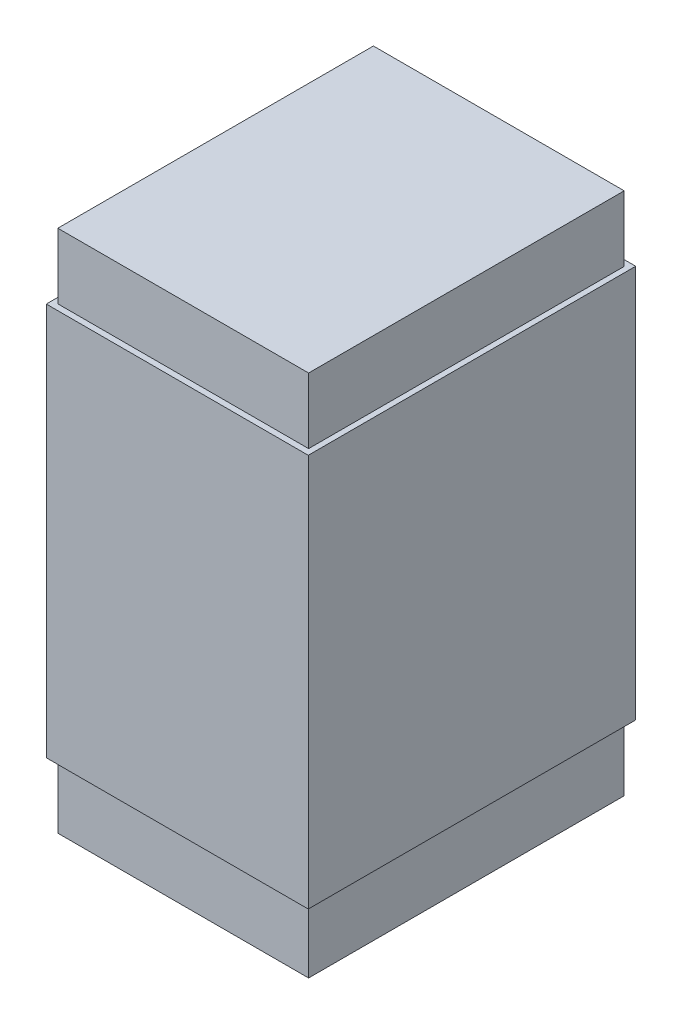
ISO-10303-21;
HEADER;
FILE_DESCRIPTION(('STEP AP214'),'2;1');
FILE_NAME('part.step','',(''),(''),'','','');
FILE_SCHEMA(('AUTOMOTIVE_DESIGN { 1 0 10303 214 1 1 1 1 }'));
ENDSEC;
DATA;
#1=APPLICATION_CONTEXT('core data for automotive mechanical design processes');
#2=APPLICATION_PROTOCOL_DEFINITION('international standard','automotive_design',2000,#1);
#3=PRODUCT_CONTEXT('',#1,'mechanical');
#4=PRODUCT('Part','Part','',(#3));
#5=PRODUCT_RELATED_PRODUCT_CATEGORY('part','',(#4));
#6=PRODUCT_DEFINITION_FORMATION('','',#4);
#7=PRODUCT_DEFINITION_CONTEXT('part definition',#1,'design');
#8=PRODUCT_DEFINITION('design','',#6,#7);
#9=PRODUCT_DEFINITION_SHAPE('','',#8);
#10=(LENGTH_UNIT() NAMED_UNIT(*) SI_UNIT(.MILLI.,.METRE.));
#11=(NAMED_UNIT(*) PLANE_ANGLE_UNIT() SI_UNIT($,.RADIAN.));
#12=(NAMED_UNIT(*) SI_UNIT($,.STERADIAN.) SOLID_ANGLE_UNIT());
#13=UNCERTAINTY_MEASURE_WITH_UNIT(LENGTH_MEASURE(1.E-05),#10,'distance_accuracy_value','');
#14=(GEOMETRIC_REPRESENTATION_CONTEXT(3) GLOBAL_UNCERTAINTY_ASSIGNED_CONTEXT((#13)) GLOBAL_UNIT_ASSIGNED_CONTEXT((#10,
#11,#12)) REPRESENTATION_CONTEXT('',''));
#15=CARTESIAN_POINT('',(0.,0.,0.));
#16=DIRECTION('',(0.,0.,1.));
#17=DIRECTION('',(1.,0.,0.));
#18=AXIS2_PLACEMENT_3D('',#15,#16,#17);
#19=CARTESIAN_POINT('',(0.,0.,0.));
#20=DIRECTION('',(0.,-1.,0.));
#21=DIRECTION('',(0.,0.,-1.));
#22=AXIS2_PLACEMENT_3D('',#19,#20,#21);
#23=PLANE('',#22);
#24=DIRECTION('',(0.,0.,-1.));
#25=VECTOR('',#24,1.);
#26=CARTESIAN_POINT('',(0.4,0.,0.5));
#27=LINE('',#26,#25);
#28=CARTESIAN_POINT('',(0.4,0.,0.5));
#29=VERTEX_POINT('',#28);
#30=CARTESIAN_POINT('',(0.4,0.,-0.5));
#31=VERTEX_POINT('',#30);
#32=EDGE_CURVE('E181',#29,#31,#27,.T.);
#33=ORIENTED_EDGE('',*,*,#32,.F.);
#34=DIRECTION('',(1.,0.,0.));
#35=VECTOR('',#34,1.);
#36=CARTESIAN_POINT('',(-0.4,0.,0.5));
#37=LINE('',#36,#35);
#38=CARTESIAN_POINT('',(-0.4,0.,0.5));
#39=VERTEX_POINT('',#38);
#40=EDGE_CURVE('E186',#39,#29,#37,.T.);
#41=ORIENTED_EDGE('',*,*,#40,.F.);
#42=DIRECTION('',(0.,0.,1.));
#43=VECTOR('',#42,1.);
#44=CARTESIAN_POINT('',(-0.4,0.,0.5));
#45=LINE('',#44,#43);
#46=CARTESIAN_POINT('',(-0.4,0.,-0.5));
#47=VERTEX_POINT('',#46);
#48=EDGE_CURVE('E197',#47,#39,#45,.T.);
#49=ORIENTED_EDGE('',*,*,#48,.F.);
#50=DIRECTION('',(-1.,0.,0.));
#51=VECTOR('',#50,1.);
#52=CARTESIAN_POINT('',(-0.4,0.,-0.5));
#53=LINE('',#52,#51);
#54=EDGE_CURVE('E195',#31,#47,#53,.T.);
#55=ORIENTED_EDGE('',*,*,#54,.F.);
#56=EDGE_LOOP('',(#33,#41,#49,#55));
#57=FACE_BOUND('',#56,.T.);
#58=DIRECTION('',(-1.,0.,0.));
#59=VECTOR('',#58,1.);
#60=CARTESIAN_POINT('',(0.382947673415401,0.,0.481860311538185));
#61=LINE('',#60,#59);
#62=CARTESIAN_POINT('',(0.382947673415401,0.,0.481860311538185));
#63=VERTEX_POINT('',#62);
#64=CARTESIAN_POINT('',(-0.382947673415401,0.,0.481860311538185));
#65=VERTEX_POINT('',#64);
#66=EDGE_CURVE('E371',#63,#65,#61,.T.);
#67=ORIENTED_EDGE('',*,*,#66,.F.);
#68=DIRECTION('',(0.,0.,1.));
#69=VECTOR('',#68,1.);
#70=CARTESIAN_POINT('',(0.382947673415401,0.,-0.481860311538185));
#71=LINE('',#70,#69);
#72=CARTESIAN_POINT('',(0.382947673415401,0.,-0.481860311538185));
#73=VERTEX_POINT('',#72);
#74=EDGE_CURVE('E145',#73,#63,#71,.T.);
#75=ORIENTED_EDGE('',*,*,#74,.F.);
#76=DIRECTION('',(1.,0.,0.));
#77=VECTOR('',#76,1.);
#78=CARTESIAN_POINT('',(-0.382947673415401,0.,-0.481860311538185));
#79=LINE('',#78,#77);
#80=CARTESIAN_POINT('',(-0.382947673415401,0.,-0.481860311538185));
#81=VERTEX_POINT('',#80);
#82=EDGE_CURVE('E141',#81,#73,#79,.T.);
#83=ORIENTED_EDGE('',*,*,#82,.F.);
#84=DIRECTION('',(0.,0.,-1.));
#85=VECTOR('',#84,1.);
#86=CARTESIAN_POINT('',(-0.382947673415401,0.,0.481860311538185));
#87=LINE('',#86,#85);
#88=EDGE_CURVE('E368',#65,#81,#87,.T.);
#89=ORIENTED_EDGE('',*,*,#88,.F.);
#90=EDGE_LOOP('',(#67,#75,#83,#89));
#91=FACE_BOUND('',#90,.T.);
#92=ADVANCED_FACE('F33',(#57,#91),#23,.T.);
#93=CARTESIAN_POINT('',(0.,1.2,0.));
#94=DIRECTION('',(0.,-1.,0.));
#95=DIRECTION('',(0.,0.,-1.));
#96=AXIS2_PLACEMENT_3D('',#93,#94,#95);
#97=PLANE('',#96);
#98=DIRECTION('',(0.,0.,-1.));
#99=VECTOR('',#98,1.);
#100=CARTESIAN_POINT('',(0.4,1.2,0.5));
#101=LINE('',#100,#99);
#102=CARTESIAN_POINT('',(0.4,1.2,0.5));
#103=VERTEX_POINT('',#102);
#104=CARTESIAN_POINT('',(0.4,1.2,-0.5));
#105=VERTEX_POINT('',#104);
#106=EDGE_CURVE('E182',#103,#105,#101,.T.);
#107=ORIENTED_EDGE('',*,*,#106,.T.);
#108=DIRECTION('',(-1.,0.,0.));
#109=VECTOR('',#108,1.);
#110=CARTESIAN_POINT('',(-0.4,1.2,-0.5));
#111=LINE('',#110,#109);
#112=CARTESIAN_POINT('',(-0.4,1.2,-0.5));
#113=VERTEX_POINT('',#112);
#114=EDGE_CURVE('E185',#105,#113,#111,.T.);
#115=ORIENTED_EDGE('',*,*,#114,.T.);
#116=DIRECTION('',(0.,0.,1.));
#117=VECTOR('',#116,1.);
#118=CARTESIAN_POINT('',(-0.4,1.2,0.5));
#119=LINE('',#118,#117);
#120=CARTESIAN_POINT('',(-0.4,1.2,0.5));
#121=VERTEX_POINT('',#120);
#122=EDGE_CURVE('E188',#113,#121,#119,.T.);
#123=ORIENTED_EDGE('',*,*,#122,.T.);
#124=DIRECTION('',(1.,0.,0.));
#125=VECTOR('',#124,1.);
#126=CARTESIAN_POINT('',(-0.4,1.2,0.5));
#127=LINE('',#126,#125);
#128=EDGE_CURVE('E190',#121,#103,#127,.T.);
#129=ORIENTED_EDGE('',*,*,#128,.T.);
#130=EDGE_LOOP('',(#107,#115,#123,#129));
#131=FACE_BOUND('',#130,.T.);
#132=DIRECTION('',(0.,0.,-1.));
#133=VECTOR('',#132,1.);
#134=CARTESIAN_POINT('',(0.382947673415401,1.2,0.481860311538185));
#135=LINE('',#134,#133);
#136=CARTESIAN_POINT('',(0.382947673415401,1.2,0.481860311538185));
#137=VERTEX_POINT('',#136);
#138=CARTESIAN_POINT('',(0.382947673415401,1.2,-0.481860311538185));
#139=VERTEX_POINT('',#138);
#140=EDGE_CURVE('E147',#137,#139,#135,.T.);
#141=ORIENTED_EDGE('',*,*,#140,.F.);
#142=DIRECTION('',(1.,0.,0.));
#143=VECTOR('',#142,1.);
#144=CARTESIAN_POINT('',(-0.382947673415401,1.2,0.481860311538185));
#145=LINE('',#144,#143);
#146=CARTESIAN_POINT('',(-0.382947673415401,1.2,0.481860311538185));
#147=VERTEX_POINT('',#146);
#148=EDGE_CURVE('E158',#147,#137,#145,.T.);
#149=ORIENTED_EDGE('',*,*,#148,.F.);
#150=DIRECTION('',(0.,0.,1.));
#151=VECTOR('',#150,1.);
#152=CARTESIAN_POINT('',(-0.382947673415401,1.2,0.481860311538185));
#153=LINE('',#152,#151);
#154=CARTESIAN_POINT('',(-0.382947673415401,1.2,-0.481860311538185));
#155=VERTEX_POINT('',#154);
#156=EDGE_CURVE('E166',#155,#147,#153,.T.);
#157=ORIENTED_EDGE('',*,*,#156,.F.);
#158=DIRECTION('',(-1.,0.,0.));
#159=VECTOR('',#158,1.);
#160=CARTESIAN_POINT('',(-0.382947673415401,1.2,-0.481860311538185));
#161=LINE('',#160,#159);
#162=EDGE_CURVE('E56',#139,#155,#161,.T.);
#163=ORIENTED_EDGE('',*,*,#162,.F.);
#164=EDGE_LOOP('',(#141,#149,#157,#163));
#165=FACE_BOUND('',#164,.T.);
#166=ADVANCED_FACE('F224',(#131,#165),#97,.F.);
#167=CARTESIAN_POINT('',(0.4,1.2,0.5));
#168=DIRECTION('',(-1.,0.,0.));
#169=DIRECTION('',(0.,0.,1.));
#170=AXIS2_PLACEMENT_3D('',#167,#168,#169);
#171=PLANE('',#170);
#172=ORIENTED_EDGE('',*,*,#32,.T.);
#173=DIRECTION('',(0.,-1.,0.));
#174=VECTOR('',#173,1.);
#175=CARTESIAN_POINT('',(0.4,1.2,-0.5));
#176=LINE('',#175,#174);
#177=EDGE_CURVE('E11',#105,#31,#176,.T.);
#178=ORIENTED_EDGE('',*,*,#177,.F.);
#179=ORIENTED_EDGE('',*,*,#106,.F.);
#180=DIRECTION('',(0.,-1.,0.));
#181=VECTOR('',#180,1.);
#182=CARTESIAN_POINT('',(0.4,1.2,0.5));
#183=LINE('',#182,#181);
#184=EDGE_CURVE('E192',#103,#29,#183,.T.);
#185=ORIENTED_EDGE('',*,*,#184,.T.);
#186=EDGE_LOOP('',(#172,#178,#179,#185));
#187=FACE_BOUND('',#186,.T.);
#188=ADVANCED_FACE('F35',(#187),#171,.F.);
#189=CARTESIAN_POINT('',(-0.4,1.2,-0.5));
#190=DIRECTION('',(0.,0.,1.));
#191=DIRECTION('',(1.,0.,0.));
#192=AXIS2_PLACEMENT_3D('',#189,#190,#191);
#193=PLANE('',#192);
#194=ORIENTED_EDGE('',*,*,#54,.T.);
#195=DIRECTION('',(0.,-1.,0.));
#196=VECTOR('',#195,1.);
#197=CARTESIAN_POINT('',(-0.4,1.2,-0.5));
#198=LINE('',#197,#196);
#199=EDGE_CURVE('E41',#113,#47,#198,.T.);
#200=ORIENTED_EDGE('',*,*,#199,.F.);
#201=ORIENTED_EDGE('',*,*,#114,.F.);
#202=ORIENTED_EDGE('',*,*,#177,.T.);
#203=EDGE_LOOP('',(#194,#200,#201,#202));
#204=FACE_BOUND('',#203,.T.);
#205=ADVANCED_FACE('F225',(#204),#193,.F.);
#206=CARTESIAN_POINT('',(-0.4,1.2,0.5));
#207=DIRECTION('',(1.,0.,0.));
#208=DIRECTION('',(0.,0.,-1.));
#209=AXIS2_PLACEMENT_3D('',#206,#207,#208);
#210=PLANE('',#209);
#211=ORIENTED_EDGE('',*,*,#48,.T.);
#212=DIRECTION('',(0.,-1.,0.));
#213=VECTOR('',#212,1.);
#214=CARTESIAN_POINT('',(-0.4,1.2,0.5));
#215=LINE('',#214,#213);
#216=EDGE_CURVE('E202',#121,#39,#215,.T.);
#217=ORIENTED_EDGE('',*,*,#216,.F.);
#218=ORIENTED_EDGE('',*,*,#122,.F.);
#219=ORIENTED_EDGE('',*,*,#199,.T.);
#220=EDGE_LOOP('',(#211,#217,#218,#219));
#221=FACE_BOUND('',#220,.T.);
#222=ADVANCED_FACE('F209',(#221),#210,.F.);
#223=CARTESIAN_POINT('',(-0.4,1.2,0.5));
#224=DIRECTION('',(0.,0.,-1.));
#225=DIRECTION('',(-1.,0.,0.));
#226=AXIS2_PLACEMENT_3D('',#223,#224,#225);
#227=PLANE('',#226);
#228=ORIENTED_EDGE('',*,*,#40,.T.);
#229=ORIENTED_EDGE('',*,*,#184,.F.);
#230=ORIENTED_EDGE('',*,*,#128,.F.);
#231=ORIENTED_EDGE('',*,*,#216,.T.);
#232=EDGE_LOOP('',(#228,#229,#230,#231));
#233=FACE_BOUND('',#232,.T.);
#234=ADVANCED_FACE('F218',(#233),#227,.F.);
#235=CARTESIAN_POINT('',(0.382947673415401,1.4,0.481860311538185));
#236=DIRECTION('',(-1.,0.,0.));
#237=DIRECTION('',(0.,0.,1.));
#238=AXIS2_PLACEMENT_3D('',#235,#236,#237);
#239=PLANE('',#238);
#240=ORIENTED_EDGE('',*,*,#140,.T.);
#241=DIRECTION('',(0.,-1.,0.));
#242=VECTOR('',#241,1.);
#243=CARTESIAN_POINT('',(0.382947673415401,1.4,-0.481860311538185));
#244=LINE('',#243,#242);
#245=CARTESIAN_POINT('',(0.382947673415401,1.4,-0.481860311538185));
#246=VERTEX_POINT('',#245);
#247=EDGE_CURVE('E179',#246,#139,#244,.T.);
#248=ORIENTED_EDGE('',*,*,#247,.F.);
#249=DIRECTION('',(0.,0.,-1.));
#250=VECTOR('',#249,1.);
#251=CARTESIAN_POINT('',(0.382947673415401,1.4,0.481860311538185));
#252=LINE('',#251,#250);
#253=CARTESIAN_POINT('',(0.382947673415401,1.4,0.481860311538185));
#254=VERTEX_POINT('',#253);
#255=EDGE_CURVE('E154',#254,#246,#252,.T.);
#256=ORIENTED_EDGE('',*,*,#255,.F.);
#257=DIRECTION('',(0.,-1.,0.));
#258=VECTOR('',#257,1.);
#259=CARTESIAN_POINT('',(0.382947673415401,1.4,0.481860311538185));
#260=LINE('',#259,#258);
#261=EDGE_CURVE('E163',#254,#137,#260,.T.);
#262=ORIENTED_EDGE('',*,*,#261,.T.);
#263=EDGE_LOOP('',(#240,#248,#256,#262));
#264=FACE_BOUND('',#263,.T.);
#265=ADVANCED_FACE('F241',(#264),#239,.F.);
#266=CARTESIAN_POINT('',(-0.382947673415401,1.4,-0.481860311538185));
#267=DIRECTION('',(0.,0.,1.));
#268=DIRECTION('',(1.,0.,0.));
#269=AXIS2_PLACEMENT_3D('',#266,#267,#268);
#270=PLANE('',#269);
#271=ORIENTED_EDGE('',*,*,#162,.T.);
#272=DIRECTION('',(0.,-1.,0.));
#273=VECTOR('',#272,1.);
#274=CARTESIAN_POINT('',(-0.382947673415401,1.4,-0.481860311538185));
#275=LINE('',#274,#273);
#276=CARTESIAN_POINT('',(-0.382947673415401,1.4,-0.481860311538185));
#277=VERTEX_POINT('',#276);
#278=EDGE_CURVE('E176',#277,#155,#275,.T.);
#279=ORIENTED_EDGE('',*,*,#278,.F.);
#280=DIRECTION('',(-1.,0.,0.));
#281=VECTOR('',#280,1.);
#282=CARTESIAN_POINT('',(-0.382947673415401,1.4,-0.481860311538185));
#283=LINE('',#282,#281);
#284=EDGE_CURVE('E157',#246,#277,#283,.T.);
#285=ORIENTED_EDGE('',*,*,#284,.F.);
#286=ORIENTED_EDGE('',*,*,#247,.T.);
#287=EDGE_LOOP('',(#271,#279,#285,#286));
#288=FACE_BOUND('',#287,.T.);
#289=ADVANCED_FACE('F245',(#288),#270,.F.);
#290=CARTESIAN_POINT('',(-0.382947673415401,1.4,0.481860311538185));
#291=DIRECTION('',(1.,0.,0.));
#292=DIRECTION('',(0.,0.,-1.));
#293=AXIS2_PLACEMENT_3D('',#290,#291,#292);
#294=PLANE('',#293);
#295=ORIENTED_EDGE('',*,*,#156,.T.);
#296=DIRECTION('',(0.,-1.,0.));
#297=VECTOR('',#296,1.);
#298=CARTESIAN_POINT('',(-0.382947673415401,1.4,0.481860311538185));
#299=LINE('',#298,#297);
#300=CARTESIAN_POINT('',(-0.382947673415401,1.4,0.481860311538185));
#301=VERTEX_POINT('',#300);
#302=EDGE_CURVE('E173',#301,#147,#299,.T.);
#303=ORIENTED_EDGE('',*,*,#302,.F.);
#304=DIRECTION('',(0.,0.,1.));
#305=VECTOR('',#304,1.);
#306=CARTESIAN_POINT('',(-0.382947673415401,1.4,0.481860311538185));
#307=LINE('',#306,#305);
#308=EDGE_CURVE('E160',#277,#301,#307,.T.);
#309=ORIENTED_EDGE('',*,*,#308,.F.);
#310=ORIENTED_EDGE('',*,*,#278,.T.);
#311=EDGE_LOOP('',(#295,#303,#309,#310));
#312=FACE_BOUND('',#311,.T.);
#313=ADVANCED_FACE('F250',(#312),#294,.F.);
#314=CARTESIAN_POINT('',(-0.382947673415401,1.4,0.481860311538185));
#315=DIRECTION('',(0.,0.,-1.));
#316=DIRECTION('',(-1.,0.,0.));
#317=AXIS2_PLACEMENT_3D('',#314,#315,#316);
#318=PLANE('',#317);
#319=ORIENTED_EDGE('',*,*,#148,.T.);
#320=ORIENTED_EDGE('',*,*,#261,.F.);
#321=DIRECTION('',(1.,0.,0.));
#322=VECTOR('',#321,1.);
#323=CARTESIAN_POINT('',(-0.382947673415401,1.4,0.481860311538185));
#324=LINE('',#323,#322);
#325=EDGE_CURVE('E162',#301,#254,#324,.T.);
#326=ORIENTED_EDGE('',*,*,#325,.F.);
#327=ORIENTED_EDGE('',*,*,#302,.T.);
#328=EDGE_LOOP('',(#319,#320,#326,#327));
#329=FACE_BOUND('',#328,.T.);
#330=ADVANCED_FACE('F256',(#329),#318,.F.);
#331=CARTESIAN_POINT('',(0.,1.4,0.));
#332=DIRECTION('',(0.,-1.,0.));
#333=DIRECTION('',(0.,0.,-1.));
#334=AXIS2_PLACEMENT_3D('',#331,#332,#333);
#335=PLANE('',#334);
#336=ORIENTED_EDGE('',*,*,#255,.T.);
#337=ORIENTED_EDGE('',*,*,#284,.T.);
#338=ORIENTED_EDGE('',*,*,#308,.T.);
#339=ORIENTED_EDGE('',*,*,#325,.T.);
#340=EDGE_LOOP('',(#336,#337,#338,#339));
#341=FACE_BOUND('',#340,.T.);
#342=ADVANCED_FACE('F260',(#341),#335,.F.);
#343=CARTESIAN_POINT('',(0.382947673415401,-0.2,-0.481860311538185));
#344=DIRECTION('',(-1.,0.,0.));
#345=DIRECTION('',(0.,0.,1.));
#346=AXIS2_PLACEMENT_3D('',#343,#344,#345);
#347=PLANE('',#346);
#348=ORIENTED_EDGE('',*,*,#74,.T.);
#349=DIRECTION('',(0.,1.,0.));
#350=VECTOR('',#349,1.);
#351=CARTESIAN_POINT('',(0.382947673415401,-0.2,0.481860311538185));
#352=LINE('',#351,#350);
#353=CARTESIAN_POINT('',(0.382947673415401,-0.2,0.481860311538185));
#354=VERTEX_POINT('',#353);
#355=EDGE_CURVE('E126',#354,#63,#352,.T.);
#356=ORIENTED_EDGE('',*,*,#355,.F.);
#357=DIRECTION('',(0.,0.,1.));
#358=VECTOR('',#357,1.);
#359=CARTESIAN_POINT('',(0.382947673415401,-0.2,-0.481860311538185));
#360=LINE('',#359,#358);
#361=CARTESIAN_POINT('',(0.382947673415401,-0.2,-0.481860311538185));
#362=VERTEX_POINT('',#361);
#363=EDGE_CURVE('E133',#362,#354,#360,.T.);
#364=ORIENTED_EDGE('',*,*,#363,.F.);
#365=DIRECTION('',(0.,1.,0.));
#366=VECTOR('',#365,1.);
#367=CARTESIAN_POINT('',(0.382947673415401,-0.2,-0.481860311538185));
#368=LINE('',#367,#366);
#369=EDGE_CURVE('E366',#362,#73,#368,.T.);
#370=ORIENTED_EDGE('',*,*,#369,.T.);
#371=EDGE_LOOP('',(#348,#356,#364,#370));
#372=FACE_BOUND('',#371,.T.);
#373=ADVANCED_FACE('F143',(#372),#347,.F.);
#374=CARTESIAN_POINT('',(0.382947673415401,-0.2,0.481860311538185));
#375=DIRECTION('',(0.,0.,-1.));
#376=DIRECTION('',(-1.,0.,0.));
#377=AXIS2_PLACEMENT_3D('',#374,#375,#376);
#378=PLANE('',#377);
#379=ORIENTED_EDGE('',*,*,#66,.T.);
#380=DIRECTION('',(0.,1.,0.));
#381=VECTOR('',#380,1.);
#382=CARTESIAN_POINT('',(-0.382947673415401,-0.2,0.481860311538185));
#383=LINE('',#382,#381);
#384=CARTESIAN_POINT('',(-0.382947673415401,-0.2,0.481860311538185));
#385=VERTEX_POINT('',#384);
#386=EDGE_CURVE('E129',#385,#65,#383,.T.);
#387=ORIENTED_EDGE('',*,*,#386,.F.);
#388=DIRECTION('',(-1.,0.,0.));
#389=VECTOR('',#388,1.);
#390=CARTESIAN_POINT('',(0.382947673415401,-0.2,0.481860311538185));
#391=LINE('',#390,#389);
#392=EDGE_CURVE('E122',#354,#385,#391,.T.);
#393=ORIENTED_EDGE('',*,*,#392,.F.);
#394=ORIENTED_EDGE('',*,*,#355,.T.);
#395=EDGE_LOOP('',(#379,#387,#393,#394));
#396=FACE_BOUND('',#395,.T.);
#397=ADVANCED_FACE('F124',(#396),#378,.F.);
#398=CARTESIAN_POINT('',(-0.382947673415401,-0.2,0.481860311538185));
#399=DIRECTION('',(1.,0.,0.));
#400=DIRECTION('',(0.,0.,-1.));
#401=AXIS2_PLACEMENT_3D('',#398,#399,#400);
#402=PLANE('',#401);
#403=ORIENTED_EDGE('',*,*,#88,.T.);
#404=DIRECTION('',(0.,1.,0.));
#405=VECTOR('',#404,1.);
#406=CARTESIAN_POINT('',(-0.382947673415401,-0.2,-0.481860311538185));
#407=LINE('',#406,#405);
#408=CARTESIAN_POINT('',(-0.382947673415401,-0.2,-0.481860311538185));
#409=VERTEX_POINT('',#408);
#410=EDGE_CURVE('E48',#409,#81,#407,.T.);
#411=ORIENTED_EDGE('',*,*,#410,.F.);
#412=DIRECTION('',(0.,0.,-1.));
#413=VECTOR('',#412,1.);
#414=CARTESIAN_POINT('',(-0.382947673415401,-0.2,0.481860311538185));
#415=LINE('',#414,#413);
#416=EDGE_CURVE('E132',#385,#409,#415,.T.);
#417=ORIENTED_EDGE('',*,*,#416,.F.);
#418=ORIENTED_EDGE('',*,*,#386,.T.);
#419=EDGE_LOOP('',(#403,#411,#417,#418));
#420=FACE_BOUND('',#419,.T.);
#421=ADVANCED_FACE('F269',(#420),#402,.F.);
#422=CARTESIAN_POINT('',(-0.382947673415401,-0.2,-0.481860311538185));
#423=DIRECTION('',(0.,0.,1.));
#424=DIRECTION('',(1.,0.,0.));
#425=AXIS2_PLACEMENT_3D('',#422,#423,#424);
#426=PLANE('',#425);
#427=ORIENTED_EDGE('',*,*,#82,.T.);
#428=ORIENTED_EDGE('',*,*,#369,.F.);
#429=DIRECTION('',(1.,0.,0.));
#430=VECTOR('',#429,1.);
#431=CARTESIAN_POINT('',(-0.382947673415401,-0.2,-0.481860311538185));
#432=LINE('',#431,#430);
#433=EDGE_CURVE('E137',#409,#362,#432,.T.);
#434=ORIENTED_EDGE('',*,*,#433,.F.);
#435=ORIENTED_EDGE('',*,*,#410,.T.);
#436=EDGE_LOOP('',(#427,#428,#434,#435));
#437=FACE_BOUND('',#436,.T.);
#438=ADVANCED_FACE('F272',(#437),#426,.F.);
#439=CARTESIAN_POINT('',(0.,-0.2,0.));
#440=DIRECTION('',(0.,-1.,0.));
#441=DIRECTION('',(0.,0.,-1.));
#442=AXIS2_PLACEMENT_3D('',#439,#440,#441);
#443=PLANE('',#442);
#444=ORIENTED_EDGE('',*,*,#363,.T.);
#445=ORIENTED_EDGE('',*,*,#392,.T.);
#446=ORIENTED_EDGE('',*,*,#416,.T.);
#447=ORIENTED_EDGE('',*,*,#433,.T.);
#448=EDGE_LOOP('',(#444,#445,#446,#447));
#449=FACE_BOUND('',#448,.T.);
#450=ADVANCED_FACE('F136',(#449),#443,.T.);
#451=CLOSED_SHELL('',(#92,#166,#188,#205,#222,#234,#265,#289,#313,#330,#342,#373,#397,#421,#438,#450));
#452=MANIFOLD_SOLID_BREP('B2',#451);
#453=ADVANCED_BREP_SHAPE_REPRESENTATION('',(#18,#452),#14);
#454=SHAPE_DEFINITION_REPRESENTATION(#9,#453);
ENDSEC;
END-ISO-10303-21;
